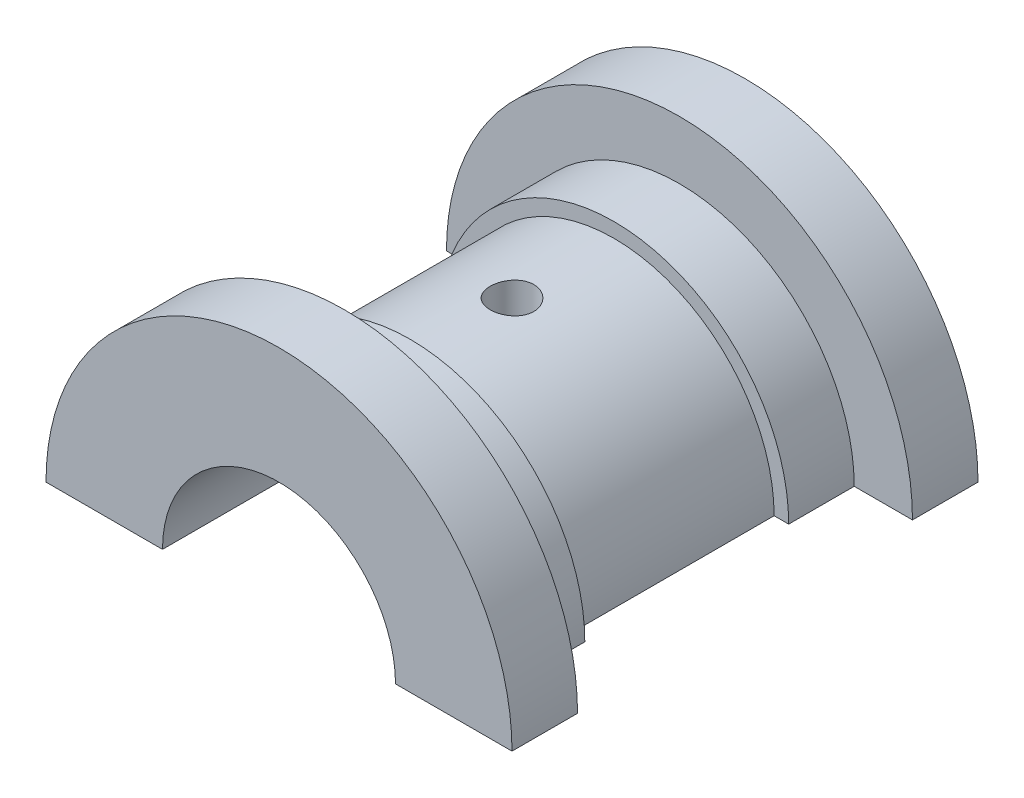
ISO-10303-21;
HEADER;
FILE_DESCRIPTION(('STEP AP214'),'2;1');
FILE_NAME('part.step','',(''),(''),'','','');
FILE_SCHEMA(('AUTOMOTIVE_DESIGN { 1 0 10303 214 1 1 1 1 }'));
ENDSEC;
DATA;
#1=APPLICATION_CONTEXT('core data for automotive mechanical design processes');
#2=APPLICATION_PROTOCOL_DEFINITION('international standard','automotive_design',2000,#1);
#3=PRODUCT_CONTEXT('',#1,'mechanical');
#4=PRODUCT('Part','Part','',(#3));
#5=PRODUCT_RELATED_PRODUCT_CATEGORY('part','',(#4));
#6=PRODUCT_DEFINITION_FORMATION('','',#4);
#7=PRODUCT_DEFINITION_CONTEXT('part definition',#1,'design');
#8=PRODUCT_DEFINITION('design','',#6,#7);
#9=PRODUCT_DEFINITION_SHAPE('','',#8);
#10=(LENGTH_UNIT() NAMED_UNIT(*) SI_UNIT(.MILLI.,.METRE.));
#11=(NAMED_UNIT(*) PLANE_ANGLE_UNIT() SI_UNIT($,.RADIAN.));
#12=(NAMED_UNIT(*) SI_UNIT($,.STERADIAN.) SOLID_ANGLE_UNIT());
#13=UNCERTAINTY_MEASURE_WITH_UNIT(LENGTH_MEASURE(1.E-05),#10,'distance_accuracy_value','');
#14=(GEOMETRIC_REPRESENTATION_CONTEXT(3) GLOBAL_UNCERTAINTY_ASSIGNED_CONTEXT((#13)) GLOBAL_UNIT_ASSIGNED_CONTEXT((#10,
#11,#12)) REPRESENTATION_CONTEXT('',''));
#15=CARTESIAN_POINT('',(0.,0.,0.));
#16=DIRECTION('',(0.,0.,1.));
#17=DIRECTION('',(1.,0.,0.));
#18=AXIS2_PLACEMENT_3D('',#15,#16,#17);
#19=CARTESIAN_POINT('',(-35.372068518765,0.,25.));
#20=DIRECTION('',(0.,1.,0.));
#21=DIRECTION('',(0.,0.,1.));
#22=AXIS2_PLACEMENT_3D('',#19,#20,#21);
#23=PLANE('',#22);
#24=DIRECTION('',(0.,0.,-1.));
#25=VECTOR('',#24,1.);
#26=CARTESIAN_POINT('',(-32.,0.,25.));
#27=LINE('',#26,#25);
#28=CARTESIAN_POINT('',(-32.,0.,16.));
#29=VERTEX_POINT('',#28);
#30=CARTESIAN_POINT('',(-32.,0.,25.));
#31=VERTEX_POINT('',#30);
#32=EDGE_CURVE('E130',#29,#31,#27,.F.);
#33=ORIENTED_EDGE('',*,*,#32,.F.);
#34=DIRECTION('',(-1.,0.,0.));
#35=VECTOR('',#34,1.);
#36=CARTESIAN_POINT('',(0.,0.,16.));
#37=LINE('',#36,#35);
#38=CARTESIAN_POINT('',(-24.,0.,16.));
#39=VERTEX_POINT('',#38);
#40=EDGE_CURVE('E149',#39,#29,#37,.T.);
#41=ORIENTED_EDGE('',*,*,#40,.F.);
#42=DIRECTION('',(0.,0.,-1.));
#43=VECTOR('',#42,1.);
#44=CARTESIAN_POINT('',(-24.,0.,16.));
#45=LINE('',#44,#43);
#46=CARTESIAN_POINT('',(-24.,0.,7.));
#47=VERTEX_POINT('',#46);
#48=EDGE_CURVE('E231',#47,#39,#45,.F.);
#49=ORIENTED_EDGE('',*,*,#48,.F.);
#50=DIRECTION('',(-1.,0.,0.));
#51=VECTOR('',#50,1.);
#52=CARTESIAN_POINT('',(0.,0.,7.));
#53=LINE('',#52,#51);
#54=CARTESIAN_POINT('',(-22.,0.,7.));
#55=VERTEX_POINT('',#54);
#56=EDGE_CURVE('E217',#55,#47,#53,.T.);
#57=ORIENTED_EDGE('',*,*,#56,.F.);
#58=DIRECTION('',(0.,0.,-1.));
#59=VECTOR('',#58,1.);
#60=CARTESIAN_POINT('',(-22.,0.,7.));
#61=LINE('',#60,#59);
#62=CARTESIAN_POINT('',(-22.,0.,-21.));
#63=VERTEX_POINT('',#62);
#64=EDGE_CURVE('E229',#63,#55,#61,.F.);
#65=ORIENTED_EDGE('',*,*,#64,.F.);
#66=DIRECTION('',(1.,0.,0.));
#67=VECTOR('',#66,1.);
#68=CARTESIAN_POINT('',(0.,0.,-21.));
#69=LINE('',#68,#67);
#70=CARTESIAN_POINT('',(-24.,0.,-21.));
#71=VERTEX_POINT('',#70);
#72=EDGE_CURVE('E211',#71,#63,#69,.T.);
#73=ORIENTED_EDGE('',*,*,#72,.F.);
#74=DIRECTION('',(0.,0.,1.));
#75=VECTOR('',#74,1.);
#76=CARTESIAN_POINT('',(-24.,0.,-30.));
#77=LINE('',#76,#75);
#78=CARTESIAN_POINT('',(-24.,0.,-30.));
#79=VERTEX_POINT('',#78);
#80=EDGE_CURVE('E65',#79,#71,#77,.T.);
#81=ORIENTED_EDGE('',*,*,#80,.F.);
#82=DIRECTION('',(1.,0.,0.));
#83=VECTOR('',#82,1.);
#84=CARTESIAN_POINT('',(0.,0.,-30.));
#85=LINE('',#84,#83);
#86=CARTESIAN_POINT('',(-32.,0.,-30.));
#87=VERTEX_POINT('',#86);
#88=EDGE_CURVE('E11',#87,#79,#85,.T.);
#89=ORIENTED_EDGE('',*,*,#88,.F.);
#90=DIRECTION('',(0.,0.,1.));
#91=VECTOR('',#90,1.);
#92=CARTESIAN_POINT('',(-32.,0.,-39.));
#93=LINE('',#92,#91);
#94=CARTESIAN_POINT('',(-32.,0.,-39.));
#95=VERTEX_POINT('',#94);
#96=EDGE_CURVE('E181',#95,#87,#93,.T.);
#97=ORIENTED_EDGE('',*,*,#96,.F.);
#98=DIRECTION('',(1.,0.,0.));
#99=VECTOR('',#98,1.);
#100=CARTESIAN_POINT('',(0.,0.,-39.));
#101=LINE('',#100,#99);
#102=CARTESIAN_POINT('',(-16.,0.,-39.));
#103=VERTEX_POINT('',#102);
#104=EDGE_CURVE('E227',#95,#103,#101,.T.);
#105=ORIENTED_EDGE('',*,*,#104,.T.);
#106=DIRECTION('',(0.,0.,-1.));
#107=VECTOR('',#106,1.);
#108=CARTESIAN_POINT('',(-16.,0.,7.));
#109=LINE('',#108,#107);
#110=CARTESIAN_POINT('',(-16.,0.,25.));
#111=VERTEX_POINT('',#110);
#112=EDGE_CURVE('E133',#103,#111,#109,.F.);
#113=ORIENTED_EDGE('',*,*,#112,.T.);
#114=DIRECTION('',(1.,0.,0.));
#115=VECTOR('',#114,1.);
#116=CARTESIAN_POINT('',(-35.372068518765,0.,25.));
#117=LINE('',#116,#115);
#118=EDGE_CURVE('E128',#31,#111,#117,.T.);
#119=ORIENTED_EDGE('',*,*,#118,.F.);
#120=EDGE_LOOP('',(#33,#41,#49,#57,#65,#73,#81,#89,#97,#105,#113,#119));
#121=FACE_BOUND('',#120,.T.);
#122=ADVANCED_FACE('F36',(#121),#23,.F.);
#123=CARTESIAN_POINT('',(0.,0.,25.));
#124=DIRECTION('',(0.,0.,1.));
#125=DIRECTION('',(1.,0.,0.));
#126=AXIS2_PLACEMENT_3D('',#123,#124,#125);
#127=PLANE('',#126);
#128=CARTESIAN_POINT('',(0.,0.,25.));
#129=DIRECTION('',(0.,0.,1.));
#130=DIRECTION('',(1.,0.,0.));
#131=AXIS2_PLACEMENT_3D('',#128,#129,#130);
#132=CIRCLE('',#131,32.);
#133=CARTESIAN_POINT('',(32.,0.,25.));
#134=VERTEX_POINT('',#133);
#135=EDGE_CURVE('E145',#134,#31,#132,.T.);
#136=ORIENTED_EDGE('',*,*,#135,.T.);
#137=ORIENTED_EDGE('',*,*,#118,.T.);
#138=CARTESIAN_POINT('',(0.,0.,25.));
#139=DIRECTION('',(0.,0.,-1.));
#140=DIRECTION('',(-1.,0.,0.));
#141=AXIS2_PLACEMENT_3D('',#138,#139,#140);
#142=CIRCLE('',#141,16.);
#143=CARTESIAN_POINT('',(16.,0.,25.));
#144=VERTEX_POINT('',#143);
#145=EDGE_CURVE('E158',#111,#144,#142,.T.);
#146=ORIENTED_EDGE('',*,*,#145,.T.);
#147=EDGE_CURVE('E138',#144,#134,#117,.T.);
#148=ORIENTED_EDGE('',*,*,#147,.T.);
#149=EDGE_LOOP('',(#136,#137,#146,#148));
#150=FACE_BOUND('',#149,.T.);
#151=ADVANCED_FACE('F152',(#150),#127,.T.);
#152=CARTESIAN_POINT('',(0.,0.,7.));
#153=DIRECTION('',(0.,0.,-1.));
#154=DIRECTION('',(-1.,0.,0.));
#155=AXIS2_PLACEMENT_3D('',#152,#153,#154);
#156=CYLINDRICAL_SURFACE('',#155,22.);
#157=CARTESIAN_POINT('',(0.,22.,-4.));
#158=CARTESIAN_POINT('',(-0.167676826859721,21.9999974934523,-4.00000703891476));
#159=CARTESIAN_POINT('',(-0.335455204579492,21.9980628542975,-4.01410518534512));
#160=CARTESIAN_POINT('',(-0.666334195282824,21.990531328169,-4.07011776644857));
#161=CARTESIAN_POINT('',(-0.829429891319713,21.984930728802,-4.11206039889967));
#162=CARTESIAN_POINT('',(-1.14610618738719,21.9706975479658,-4.22249546768124));
#163=CARTESIAN_POINT('',(-1.29969344490645,21.9620671167838,-4.29096907840417));
#164=CARTESIAN_POINT('',(-1.59317060489946,21.9427314544459,-4.45247904912042));
#165=CARTESIAN_POINT('',(-1.73306265771744,21.9320265498011,-4.54551154450858));
#166=CARTESIAN_POINT('',(-1.99611512762449,21.9096571993851,-4.75414442858463));
#167=CARTESIAN_POINT('',(-2.11917356924753,21.8979875381044,-4.86987284600693));
#168=CARTESIAN_POINT('',(-2.34418667816088,21.8750454311864,-5.12033722158478));
#169=CARTESIAN_POINT('',(-2.44614021225599,21.863773006905,-5.25507419972264));
#170=CARTESIAN_POINT('',(-2.62643701049846,21.8428507554376,-5.54040387644822));
#171=CARTESIAN_POINT('',(-2.70468332936807,21.833207660216,-5.69105837001043));
#172=CARTESIAN_POINT('',(-2.83472528970555,21.8167058813552,-6.00352363074735));
#173=CARTESIAN_POINT('',(-2.8865221221597,21.8098470723459,-6.16533389521961));
#174=CARTESIAN_POINT('',(-2.9618818111018,21.7997409938434,-6.49445248714719));
#175=CARTESIAN_POINT('',(-2.98561797729098,21.7964715644898,-6.66172043858212));
#176=CARTESIAN_POINT('',(-3.00471910119333,21.7938468760964,-6.99789494604816));
#177=CARTESIAN_POINT('',(-3.00008540995952,21.7944914306616,-7.16680142366552));
#178=CARTESIAN_POINT('',(-2.9627203403848,21.7996016067311,-7.50024345120181));
#179=CARTESIAN_POINT('',(-2.9301807783518,21.8040411420393,-7.66480095273435));
#180=CARTESIAN_POINT('',(-2.83822735390599,21.8162003481636,-7.9860980810653));
#181=CARTESIAN_POINT('',(-2.77881285300506,21.8239200969101,-8.14283752202594));
#182=CARTESIAN_POINT('',(-2.63459283520415,21.841799165874,-8.44463985207525));
#183=CARTESIAN_POINT('',(-2.54970487715522,21.851966385515,-8.58966285853603));
#184=CARTESIAN_POINT('',(-2.3570064608964,21.8735888866938,-8.86347829777156));
#185=CARTESIAN_POINT('',(-2.24919475646083,21.8850442382436,-8.99226984753348));
#186=CARTESIAN_POINT('',(-2.01265055567599,21.908067947796,-9.23107910898916));
#187=CARTESIAN_POINT('',(-1.88375290146845,21.9196364588217,-9.34093328062486));
#188=CARTESIAN_POINT('',(-1.60926188881082,21.9414949411558,-9.53747298319676));
#189=CARTESIAN_POINT('',(-1.46366847832928,21.9517849084796,-9.62415844192609));
#190=CARTESIAN_POINT('',(-1.1597859389609,21.9699350817542,-9.77190372636007));
#191=CARTESIAN_POINT('',(-1.00149126426257,21.9777942189694,-9.83295228478543));
#192=CARTESIAN_POINT('',(-0.676766175879786,21.9901879040614,-9.92755567589119));
#193=CARTESIAN_POINT('',(-0.510336216560258,21.994722637384,-9.96111204218698));
#194=CARTESIAN_POINT('',(-0.175477814735344,21.9999322760751,-9.99956416913117));
#195=CARTESIAN_POINT('',(-0.00707567277568634,22.0006374938028,-10.0046850171772));
#196=CARTESIAN_POINT('',(0.328184588178508,21.9981907754197,-9.98671624333853));
#197=CARTESIAN_POINT('',(0.495042746360838,21.9950389374767,-9.96362733943418));
#198=CARTESIAN_POINT('',(0.821806756729893,21.9852510531583,-9.89008155358068));
#199=CARTESIAN_POINT('',(0.981737441241117,21.9786288024664,-9.83973300885735));
#200=CARTESIAN_POINT('',(1.29088628219117,21.9626408812727,-9.71321048193417));
#201=CARTESIAN_POINT('',(1.44010401285043,21.9532751018062,-9.63703547396566));
#202=CARTESIAN_POINT('',(1.72458978596492,21.9327672607206,-9.46048492255194));
#203=CARTESIAN_POINT('',(1.85976745670649,21.921614741142,-9.35996499439926));
#204=CARTESIAN_POINT('',(2.11141402650921,21.8988110628535,-9.1377808440853));
#205=CARTESIAN_POINT('',(2.22788203490664,21.8871598804385,-9.01611561588667));
#206=CARTESIAN_POINT('',(2.43961065908225,21.8645773754606,-8.75409833398319));
#207=CARTESIAN_POINT('',(2.53472132761283,21.8536515002427,-8.61362457303786));
#208=CARTESIAN_POINT('',(2.69999679098531,21.8338493008832,-8.31856338460047));
#209=CARTESIAN_POINT('',(2.77016216392283,21.8249729292469,-8.16397628428285));
#210=CARTESIAN_POINT('',(2.88331699010305,21.8103129452134,-7.84554448665362));
#211=CARTESIAN_POINT('',(2.92638854100026,21.8045199979441,-7.68172941112774));
#212=CARTESIAN_POINT('',(2.98439621095037,21.7966568632046,-7.34910695634393));
#213=CARTESIAN_POINT('',(2.99933390995801,21.7945864666819,-7.1802998579713));
#214=CARTESIAN_POINT('',(3.00061713169436,21.7944097083055,-6.84397804921808));
#215=CARTESIAN_POINT('',(2.98719829381274,21.796270677241,-6.6764642067832));
#216=CARTESIAN_POINT('',(2.93265092877067,21.8036764010729,-6.34609772260303));
#217=CARTESIAN_POINT('',(2.89152241742378,21.809221153867,-6.18324507819769));
#218=CARTESIAN_POINT('',(2.7828011290096,21.8233590163958,-5.86686972122972));
#219=CARTESIAN_POINT('',(2.71522193961382,21.8319505607859,-5.71334226503493));
#220=CARTESIAN_POINT('',(2.55554079678239,21.85121622249,-5.41976740278728));
#221=CARTESIAN_POINT('',(2.46343830731648,21.8618903853246,-5.2797202914789));
#222=CARTESIAN_POINT('',(2.25645830446166,21.884224598437,-5.01587992680043));
#223=CARTESIAN_POINT('',(2.14140556846805,21.8958918112072,-4.89222472755498));
#224=CARTESIAN_POINT('',(1.89215973610724,21.9188357460712,-4.66588930657844));
#225=CARTESIAN_POINT('',(1.7579621639157,21.9301123760831,-4.56321400337727));
#226=CARTESIAN_POINT('',(1.473530986404,21.9510618593984,-4.38134806523328));
#227=CARTESIAN_POINT('',(1.32322763703472,21.9607272329125,-4.30226568344735));
#228=CARTESIAN_POINT('',(1.01141938786063,21.9772907411432,-4.17058103789405));
#229=CARTESIAN_POINT('',(0.849926624043751,21.9841918205545,-4.1179505806126));
#230=CARTESIAN_POINT('',(0.573037194174378,21.9928235213462,-4.05297912587211));
#231=CARTESIAN_POINT('',(0.459371577392145,21.9955012855773,-4.03314127840531));
#232=CARTESIAN_POINT('',(0.230486627293773,21.9990903781477,-4.00664935803757));
#233=CARTESIAN_POINT('',(0.1152673085954,22.0000017230944,-3.9999951611873));
#234=CARTESIAN_POINT('',(0.,22.,-4.));
#235=B_SPLINE_CURVE_WITH_KNOTS('',3,(#157,#158,#159,#160,#161,#162,#163,#164,#165,#166,#167,
#168,#169,#170,#171,#172,#173,#174,#175,#176,#177,#178,#179,#180,#181,#182,#183,#184,#185,#186,
#187,#188,#189,#190,#191,#192,#193,#194,#195,#196,#197,#198,#199,#200,#201,#202,#203,#204,#205,
#206,#207,#208,#209,#210,#211,#212,#213,#214,#215,#216,#217,#218,#219,#220,#221,#222,#223,#224,
#225,#226,#227,#228,#229,#230,#231,#232,#233,#234),.UNSPECIFIED.,.T.,.F.,(4,2,2,2,2,2,2,2,2,2,2,
2,2,2,2,2,2,2,2,2,2,2,2,2,2,2,2,2,2,2,2,2,2,2,2,2,2,2,4),(0.,0.502609376172301,1.00572851685898,
1.50849131075064,2.0111750366105,2.51678051739006,3.02241313883223,3.53008635854344,
4.03773671636778,4.54223504001235,5.04670933820383,5.54774357745448,6.04878972077749,
6.55147524370068,7.05418810159109,7.56104569493679,8.06790486792019,8.57498657022924,
9.08203998373342,9.58507392409649,10.0880950617602,10.5891315761909,11.0901879929896,
11.5942921539578,12.0984203054351,12.6059843025882,13.1135365364146,13.619543320099,
14.1255216863572,14.6273119749012,15.1291019770798,15.6306345481248,16.1321780825684,
16.6377084708874,17.1433572401882,17.6512916404935,18.1586835098852,18.5041992012525,
18.8497116441535),.UNSPECIFIED.);
#236=CARTESIAN_POINT('',(0.,22.,-4.));
#237=VERTEX_POINT('',#236);
#238=EDGE_CURVE('E288',#237,#237,#235,.T.);
#239=ORIENTED_EDGE('',*,*,#238,.T.);
#240=EDGE_LOOP('',(#239));
#241=FACE_BOUND('',#240,.T.);
#242=CARTESIAN_POINT('',(0.,0.,7.));
#243=DIRECTION('',(0.,0.,1.));
#244=DIRECTION('',(1.,0.,0.));
#245=AXIS2_PLACEMENT_3D('',#242,#243,#244);
#246=CIRCLE('',#245,22.);
#247=CARTESIAN_POINT('',(22.,0.,7.));
#248=VERTEX_POINT('',#247);
#249=EDGE_CURVE('E164',#248,#55,#246,.T.);
#250=ORIENTED_EDGE('',*,*,#249,.F.);
#251=DIRECTION('',(0.,0.,-1.));
#252=VECTOR('',#251,1.);
#253=CARTESIAN_POINT('',(22.,0.,7.));
#254=LINE('',#253,#252);
#255=CARTESIAN_POINT('',(22.,0.,-21.));
#256=VERTEX_POINT('',#255);
#257=EDGE_CURVE('E203',#248,#256,#254,.T.);
#258=ORIENTED_EDGE('',*,*,#257,.T.);
#259=CARTESIAN_POINT('',(0.,0.,-21.));
#260=DIRECTION('',(0.,0.,1.));
#261=DIRECTION('',(1.,0.,0.));
#262=AXIS2_PLACEMENT_3D('',#259,#260,#261);
#263=CIRCLE('',#262,22.);
#264=EDGE_CURVE('E190',#256,#63,#263,.T.);
#265=ORIENTED_EDGE('',*,*,#264,.T.);
#266=ORIENTED_EDGE('',*,*,#64,.T.);
#267=EDGE_LOOP('',(#250,#258,#265,#266));
#268=FACE_BOUND('',#267,.T.);
#269=ADVANCED_FACE('F38',(#241,#268),#156,.T.);
#270=CARTESIAN_POINT('',(0.,0.,7.));
#271=DIRECTION('',(0.,0.,-1.));
#272=DIRECTION('',(-1.,0.,0.));
#273=AXIS2_PLACEMENT_3D('',#270,#271,#272);
#274=CYLINDRICAL_SURFACE('',#273,16.);
#275=CARTESIAN_POINT('',(0.,16.,-4.));
#276=CARTESIAN_POINT('',(-0.166943492930942,15.999996976677,-4.00000637917655));
#277=CARTESIAN_POINT('',(-0.333969985460197,15.9973601984343,-4.01398215323876));
#278=CARTESIAN_POINT('',(-0.663316259683595,15.9870957178104,-4.06947999023669));
#279=CARTESIAN_POINT('',(-0.825631948304451,15.9794638033379,-4.11102530127947));
#280=CARTESIAN_POINT('',(-1.1407459237036,15.9600627753092,-4.22034540251868));
#281=CARTESIAN_POINT('',(-1.29355266137069,15.9482973989297,-4.28809650490509));
#282=CARTESIAN_POINT('',(-1.58561594618801,15.9219142119957,-4.44783775384563));
#283=CARTESIAN_POINT('',(-1.72487358895465,15.9072966323658,-4.53982593828964));
#284=CARTESIAN_POINT('',(-1.987567431861,15.8766267286101,-4.74659953600735));
#285=CARTESIAN_POINT('',(-2.11081791006366,15.860560697127,-4.86161888934027));
#286=CARTESIAN_POINT('',(-2.33639212270738,15.828906369173,-5.11068661817512));
#287=CARTESIAN_POINT('',(-2.43871435378483,15.8133181070905,-5.24473635953857));
#288=CARTESIAN_POINT('',(-2.62029997331586,15.7842510249001,-5.52937217672794));
#289=CARTESIAN_POINT('',(-2.69937443939211,15.7707898777236,-5.68008074063447));
#290=CARTESIAN_POINT('',(-2.83101048664566,15.7476942642397,-5.99293783035358));
#291=CARTESIAN_POINT('',(-2.88357435426196,15.7380594679392,-6.15508536822243));
#292=CARTESIAN_POINT('',(-2.96010107007,15.723845391491,-6.48423046182882));
#293=CARTESIAN_POINT('',(-2.98438780384078,15.7192089073281,-6.65115019440693));
#294=CARTESIAN_POINT('',(-3.00467616190693,15.7153439430552,-6.9867547696165));
#295=CARTESIAN_POINT('',(-3.00068032270748,15.7161149779752,-7.1554394526046));
#296=CARTESIAN_POINT('',(-2.96477959204725,15.7229258540351,-7.48743905053209));
#297=CARTESIAN_POINT('',(-2.9332429999209,15.7288961629467,-7.65079542860031));
#298=CARTESIAN_POINT('',(-2.84373598792414,15.7453236656933,-7.96985683956522));
#299=CARTESIAN_POINT('',(-2.78576444478999,15.7557810501903,-8.1255615470186));
#300=CARTESIAN_POINT('',(-2.644672943586,15.7800771058518,-8.42597735800053));
#301=CARTESIAN_POINT('',(-2.56140427064912,15.7939356764673,-8.57061694116162));
#302=CARTESIAN_POINT('',(-2.37218737860832,15.8234594320584,-8.84400945708047));
#303=CARTESIAN_POINT('',(-2.26623685778532,15.8391248003104,-8.9727607754296));
#304=CARTESIAN_POINT('',(-2.03267811370595,15.8708000254433,-9.21284991134492));
#305=CARTESIAN_POINT('',(-1.90475487372137,15.8868114204806,-9.32388130490349));
#306=CARTESIAN_POINT('',(-1.63193607419765,15.9171477221664,-9.52295448135081));
#307=CARTESIAN_POINT('',(-1.48704034451154,15.9314726119049,-9.61099603374084));
#308=CARTESIAN_POINT('',(-1.18406997774934,15.9568507935502,-9.76163550774003));
#309=CARTESIAN_POINT('',(-1.02597912889299,15.9678999827258,-9.82420155823579));
#310=CARTESIAN_POINT('',(-0.701278230797393,15.9854501080544,-9.92180418618432));
#311=CARTESIAN_POINT('',(-0.534669088555573,15.9919515273599,-9.95684368809071));
#312=CARTESIAN_POINT('',(-0.200297305806769,15.9996072128396,-9.99797206203654));
#313=CARTESIAN_POINT('',(-0.0325880252682693,16.0008390182456,-10.0044807830595));
#314=CARTESIAN_POINT('',(0.301522496184369,15.9980308719646,-9.9894890409047));
#315=CARTESIAN_POINT('',(0.467923800960771,15.9939911792886,-9.96798995386948));
#316=CARTESIAN_POINT('',(0.793363146436435,15.9811422300081,-9.89794192963327));
#317=CARTESIAN_POINT('',(0.952448522092127,15.9723704474806,-9.84960543492437));
#318=CARTESIAN_POINT('',(1.26025726364927,15.95103684425,-9.72748458644243));
#319=CARTESIAN_POINT('',(1.40897992519021,15.9384747662267,-9.65369850486843));
#320=CARTESIAN_POINT('',(1.69363334302643,15.9107606071533,-9.48184374368098));
#321=CARTESIAN_POINT('',(1.82940655403024,15.8955817234913,-9.38351852292632));
#322=CARTESIAN_POINT('',(2.08267664652909,15.8643868697942,-9.16572372527528));
#323=CARTESIAN_POINT('',(2.20017181952173,15.8483708216937,-9.04625217399734));
#324=CARTESIAN_POINT('',(2.41514591744096,15.817049513949,-8.78765536217715));
#325=CARTESIAN_POINT('',(2.51233832437153,15.8017565172051,-8.64829018374923));
#326=CARTESIAN_POINT('',(2.68193350115574,15.7738597115706,-8.3549647509525));
#327=CARTESIAN_POINT('',(2.75433719227848,15.761255802747,-8.20100503925905));
#328=CARTESIAN_POINT('',(2.87189347025646,15.7402604841915,-7.88358826551493));
#329=CARTESIAN_POINT('',(2.91717737589572,15.7318488087376,-7.72018124088134));
#330=CARTESIAN_POINT('',(2.97961358652471,15.7201440760483,-7.3879055549572));
#331=CARTESIAN_POINT('',(2.99676906541416,15.7168504413158,-7.2190375120592));
#332=CARTESIAN_POINT('',(3.00235524296709,15.7157839960771,-6.88350333711698));
#333=CARTESIAN_POINT('',(2.99123790006998,15.7179243194859,-6.71684483808601));
#334=CARTESIAN_POINT('',(2.94158350757606,15.7272920132,-6.38781715590943));
#335=CARTESIAN_POINT('',(2.90304662178664,15.7345193531149,-6.22544794714512));
#336=CARTESIAN_POINT('',(2.79983775166526,15.7532101604636,-5.90985103040904));
#337=CARTESIAN_POINT('',(2.73521470794505,15.7646656918993,-5.75660681730846));
#338=CARTESIAN_POINT('',(2.58171737824408,15.7905277510368,-5.46306349151831));
#339=CARTESIAN_POINT('',(2.49284137896371,15.8049344872024,-5.32276529431044));
#340=CARTESIAN_POINT('',(2.2917897467907,15.8353453221549,-5.05683263991541));
#341=CARTESIAN_POINT('',(2.17928519728607,15.8513701070609,-4.93144917486579));
#342=CARTESIAN_POINT('',(1.93485585348458,15.8830566783747,-4.70118967507095));
#343=CARTESIAN_POINT('',(1.80292660378323,15.8987183805466,-4.59631835803973));
#344=CARTESIAN_POINT('',(1.52196989014375,15.928079519361,-4.40917809474588));
#345=CARTESIAN_POINT('',(1.37279918128103,15.9417600198112,-4.32712114301872));
#346=CARTESIAN_POINT('',(1.06258022730767,15.9654323876137,-4.18936472678973));
#347=CARTESIAN_POINT('',(0.901543303410496,15.9754277175807,-4.13364050590618));
#348=CARTESIAN_POINT('',(0.616694405650309,15.9885658141526,-4.06144537116265));
#349=CARTESIAN_POINT('',(0.494547620503743,15.9928294175641,-4.0384427393744));
#350=CARTESIAN_POINT('',(0.248282494230318,15.9985475990802,-4.00771787576711));
#351=CARTESIAN_POINT('',(0.12416420330542,16.0000022485961,-3.99999525548819));
#352=CARTESIAN_POINT('',(0.,16.,-4.));
#353=B_SPLINE_CURVE_WITH_KNOTS('',3,(#275,#276,#277,#278,#279,#280,#281,#282,#283,#284,#285,
#286,#287,#288,#289,#290,#291,#292,#293,#294,#295,#296,#297,#298,#299,#300,#301,#302,#303,#304,
#305,#306,#307,#308,#309,#310,#311,#312,#313,#314,#315,#316,#317,#318,#319,#320,#321,#322,#323,
#324,#325,#326,#327,#328,#329,#330,#331,#332,#333,#334,#335,#336,#337,#338,#339,#340,#341,#342,
#343,#344,#345,#346,#347,#348,#349,#350,#351,#352),.UNSPECIFIED.,.T.,.F.,(4,2,2,2,2,2,2,2,2,2,2,
2,2,2,2,2,2,2,2,2,2,2,2,2,2,2,2,2,2,2,2,2,2,2,2,2,2,2,4),(0.,0.500376401929848,1.0011752850709,
1.50152254246181,2.00182930673781,2.50750236027261,3.01321172567233,3.52292381008715,
4.03259192623897,4.53636302890672,5.04008895174512,5.53718001225531,6.03429219693573,
6.53438525259062,7.03452908099719,7.54255536928154,8.05058675089895,8.55925176643398,
9.06786273347491,9.56896348152194,10.0700396092917,10.5672046781566,11.0644035067606,
11.5670355603542,12.069714568262,12.579068739746,13.0884039790989,13.5952525563712,
14.1020439389303,14.600785044635,15.0995231708301,15.5973299241539,16.0951718531085,
16.6004673993276,17.1058790252451,17.6158409783263,18.1253225386235,18.4974868904882,
18.8696417807908),.UNSPECIFIED.);
#354=CARTESIAN_POINT('',(0.,16.,-4.));
#355=VERTEX_POINT('',#354);
#356=EDGE_CURVE('E41',#355,#355,#353,.T.);
#357=ORIENTED_EDGE('',*,*,#356,.F.);
#358=EDGE_LOOP('',(#357));
#359=FACE_BOUND('',#358,.T.);
#360=DIRECTION('',(0.,0.,-1.));
#361=VECTOR('',#360,1.);
#362=CARTESIAN_POINT('',(16.,0.,7.));
#363=LINE('',#362,#361);
#364=CARTESIAN_POINT('',(16.,0.,-39.));
#365=VERTEX_POINT('',#364);
#366=EDGE_CURVE('E201',#144,#365,#363,.T.);
#367=ORIENTED_EDGE('',*,*,#366,.F.);
#368=ORIENTED_EDGE('',*,*,#145,.F.);
#369=ORIENTED_EDGE('',*,*,#112,.F.);
#370=CARTESIAN_POINT('',(0.,0.,-39.));
#371=DIRECTION('',(0.,0.,-1.));
#372=DIRECTION('',(-1.,0.,0.));
#373=AXIS2_PLACEMENT_3D('',#370,#371,#372);
#374=CIRCLE('',#373,16.);
#375=EDGE_CURVE('E148',#103,#365,#374,.T.);
#376=ORIENTED_EDGE('',*,*,#375,.T.);
#377=EDGE_LOOP('',(#367,#368,#369,#376));
#378=FACE_BOUND('',#377,.T.);
#379=ADVANCED_FACE('F199',(#359,#378),#274,.F.);
#380=CARTESIAN_POINT('',(0.,0.,16.));
#381=DIRECTION('',(0.,0.,-1.));
#382=DIRECTION('',(-1.,0.,0.));
#383=AXIS2_PLACEMENT_3D('',#380,#381,#382);
#384=CYLINDRICAL_SURFACE('',#383,24.);
#385=CARTESIAN_POINT('',(0.,0.,16.));
#386=DIRECTION('',(0.,0.,1.));
#387=DIRECTION('',(1.,0.,0.));
#388=AXIS2_PLACEMENT_3D('',#385,#386,#387);
#389=CIRCLE('',#388,24.);
#390=CARTESIAN_POINT('',(24.,0.,16.));
#391=VERTEX_POINT('',#390);
#392=EDGE_CURVE('E156',#391,#39,#389,.T.);
#393=ORIENTED_EDGE('',*,*,#392,.F.);
#394=DIRECTION('',(0.,0.,-1.));
#395=VECTOR('',#394,1.);
#396=CARTESIAN_POINT('',(24.,0.,16.));
#397=LINE('',#396,#395);
#398=CARTESIAN_POINT('',(24.,0.,7.));
#399=VERTEX_POINT('',#398);
#400=EDGE_CURVE('E216',#391,#399,#397,.T.);
#401=ORIENTED_EDGE('',*,*,#400,.T.);
#402=CARTESIAN_POINT('',(0.,0.,7.));
#403=DIRECTION('',(0.,0.,1.));
#404=DIRECTION('',(1.,0.,0.));
#405=AXIS2_PLACEMENT_3D('',#402,#403,#404);
#406=CIRCLE('',#405,24.);
#407=EDGE_CURVE('E153',#399,#47,#406,.T.);
#408=ORIENTED_EDGE('',*,*,#407,.T.);
#409=ORIENTED_EDGE('',*,*,#48,.T.);
#410=EDGE_LOOP('',(#393,#401,#408,#409));
#411=FACE_BOUND('',#410,.T.);
#412=ADVANCED_FACE('F240',(#411),#384,.T.);
#413=CARTESIAN_POINT('',(0.,0.,7.));
#414=DIRECTION('',(0.,0.,1.));
#415=DIRECTION('',(1.,0.,0.));
#416=AXIS2_PLACEMENT_3D('',#413,#414,#415);
#417=PLANE('',#416);
#418=ORIENTED_EDGE('',*,*,#407,.F.);
#419=EDGE_CURVE('E206',#399,#248,#53,.T.);
#420=ORIENTED_EDGE('',*,*,#419,.T.);
#421=ORIENTED_EDGE('',*,*,#249,.T.);
#422=ORIENTED_EDGE('',*,*,#56,.T.);
#423=EDGE_LOOP('',(#418,#420,#421,#422));
#424=FACE_BOUND('',#423,.T.);
#425=ADVANCED_FACE('F238',(#424),#417,.F.);
#426=CARTESIAN_POINT('',(0.,0.,25.));
#427=DIRECTION('',(0.,0.,-1.));
#428=DIRECTION('',(-1.,0.,0.));
#429=AXIS2_PLACEMENT_3D('',#426,#427,#428);
#430=CYLINDRICAL_SURFACE('',#429,32.);
#431=ORIENTED_EDGE('',*,*,#135,.F.);
#432=DIRECTION('',(0.,0.,-1.));
#433=VECTOR('',#432,1.);
#434=CARTESIAN_POINT('',(32.,0.,25.));
#435=LINE('',#434,#433);
#436=CARTESIAN_POINT('',(32.,0.,16.));
#437=VERTEX_POINT('',#436);
#438=EDGE_CURVE('E223',#134,#437,#435,.T.);
#439=ORIENTED_EDGE('',*,*,#438,.T.);
#440=CARTESIAN_POINT('',(0.,0.,16.));
#441=DIRECTION('',(0.,0.,1.));
#442=DIRECTION('',(1.,0.,0.));
#443=AXIS2_PLACEMENT_3D('',#440,#441,#442);
#444=CIRCLE('',#443,32.);
#445=EDGE_CURVE('E147',#437,#29,#444,.T.);
#446=ORIENTED_EDGE('',*,*,#445,.T.);
#447=ORIENTED_EDGE('',*,*,#32,.T.);
#448=EDGE_LOOP('',(#431,#439,#446,#447));
#449=FACE_BOUND('',#448,.T.);
#450=ADVANCED_FACE('F143',(#449),#430,.T.);
#451=CARTESIAN_POINT('',(0.,0.,16.));
#452=DIRECTION('',(0.,0.,1.));
#453=DIRECTION('',(1.,0.,0.));
#454=AXIS2_PLACEMENT_3D('',#451,#452,#453);
#455=PLANE('',#454);
#456=ORIENTED_EDGE('',*,*,#445,.F.);
#457=EDGE_CURVE('E220',#437,#391,#37,.T.);
#458=ORIENTED_EDGE('',*,*,#457,.T.);
#459=ORIENTED_EDGE('',*,*,#392,.T.);
#460=ORIENTED_EDGE('',*,*,#40,.T.);
#461=EDGE_LOOP('',(#456,#458,#459,#460));
#462=FACE_BOUND('',#461,.T.);
#463=ADVANCED_FACE('F243',(#462),#455,.F.);
#464=CARTESIAN_POINT('',(0.,0.,-30.));
#465=DIRECTION('',(0.,0.,1.));
#466=DIRECTION('',(-1.,0.,0.));
#467=AXIS2_PLACEMENT_3D('',#464,#465,#466);
#468=CYLINDRICAL_SURFACE('',#467,24.);
#469=CARTESIAN_POINT('',(0.,0.,-30.));
#470=DIRECTION('',(0.,0.,1.));
#471=DIRECTION('',(1.,0.,0.));
#472=AXIS2_PLACEMENT_3D('',#469,#470,#471);
#473=CIRCLE('',#472,24.);
#474=CARTESIAN_POINT('',(24.,0.,-30.));
#475=VERTEX_POINT('',#474);
#476=EDGE_CURVE('E174',#475,#79,#473,.T.);
#477=ORIENTED_EDGE('',*,*,#476,.T.);
#478=ORIENTED_EDGE('',*,*,#80,.T.);
#479=CARTESIAN_POINT('',(0.,0.,-21.));
#480=DIRECTION('',(0.,0.,1.));
#481=DIRECTION('',(1.,0.,0.));
#482=AXIS2_PLACEMENT_3D('',#479,#480,#481);
#483=CIRCLE('',#482,24.);
#484=CARTESIAN_POINT('',(24.,0.,-21.));
#485=VERTEX_POINT('',#484);
#486=EDGE_CURVE('E184',#485,#71,#483,.T.);
#487=ORIENTED_EDGE('',*,*,#486,.F.);
#488=DIRECTION('',(0.,0.,1.));
#489=VECTOR('',#488,1.);
#490=CARTESIAN_POINT('',(24.,0.,-30.));
#491=LINE('',#490,#489);
#492=EDGE_CURVE('E284',#485,#475,#491,.F.);
#493=ORIENTED_EDGE('',*,*,#492,.T.);
#494=EDGE_LOOP('',(#477,#478,#487,#493));
#495=FACE_BOUND('',#494,.T.);
#496=ADVANCED_FACE('F245',(#495),#468,.T.);
#497=CARTESIAN_POINT('',(0.,0.,-21.));
#498=DIRECTION('',(0.,0.,-1.));
#499=DIRECTION('',(1.,0.,0.));
#500=AXIS2_PLACEMENT_3D('',#497,#498,#499);
#501=PLANE('',#500);
#502=ORIENTED_EDGE('',*,*,#486,.T.);
#503=ORIENTED_EDGE('',*,*,#72,.T.);
#504=ORIENTED_EDGE('',*,*,#264,.F.);
#505=EDGE_CURVE('E204',#256,#485,#69,.T.);
#506=ORIENTED_EDGE('',*,*,#505,.T.);
#507=EDGE_LOOP('',(#502,#503,#504,#506));
#508=FACE_BOUND('',#507,.T.);
#509=ADVANCED_FACE('F251',(#508),#501,.F.);
#510=CARTESIAN_POINT('',(0.,0.,-39.));
#511=DIRECTION('',(0.,0.,1.));
#512=DIRECTION('',(-1.,0.,0.));
#513=AXIS2_PLACEMENT_3D('',#510,#511,#512);
#514=CYLINDRICAL_SURFACE('',#513,32.);
#515=CARTESIAN_POINT('',(0.,0.,-39.));
#516=DIRECTION('',(0.,0.,1.));
#517=DIRECTION('',(1.,0.,0.));
#518=AXIS2_PLACEMENT_3D('',#515,#516,#517);
#519=CIRCLE('',#518,32.);
#520=CARTESIAN_POINT('',(32.,0.,-39.));
#521=VERTEX_POINT('',#520);
#522=EDGE_CURVE('E182',#521,#95,#519,.T.);
#523=ORIENTED_EDGE('',*,*,#522,.T.);
#524=ORIENTED_EDGE('',*,*,#96,.T.);
#525=CARTESIAN_POINT('',(0.,0.,-30.));
#526=DIRECTION('',(0.,0.,1.));
#527=DIRECTION('',(1.,0.,0.));
#528=AXIS2_PLACEMENT_3D('',#525,#526,#527);
#529=CIRCLE('',#528,32.);
#530=CARTESIAN_POINT('',(32.,0.,-30.));
#531=VERTEX_POINT('',#530);
#532=EDGE_CURVE('E172',#531,#87,#529,.T.);
#533=ORIENTED_EDGE('',*,*,#532,.F.);
#534=DIRECTION('',(0.,0.,1.));
#535=VECTOR('',#534,1.);
#536=CARTESIAN_POINT('',(32.,0.,-39.));
#537=LINE('',#536,#535);
#538=EDGE_CURVE('E57',#531,#521,#537,.F.);
#539=ORIENTED_EDGE('',*,*,#538,.T.);
#540=EDGE_LOOP('',(#523,#524,#533,#539));
#541=FACE_BOUND('',#540,.T.);
#542=ADVANCED_FACE('F179',(#541),#514,.T.);
#543=CARTESIAN_POINT('',(0.,0.,-39.));
#544=DIRECTION('',(0.,0.,-1.));
#545=DIRECTION('',(1.,0.,0.));
#546=AXIS2_PLACEMENT_3D('',#543,#544,#545);
#547=PLANE('',#546);
#548=ORIENTED_EDGE('',*,*,#104,.F.);
#549=ORIENTED_EDGE('',*,*,#522,.F.);
#550=EDGE_CURVE('E209',#365,#521,#101,.T.);
#551=ORIENTED_EDGE('',*,*,#550,.F.);
#552=ORIENTED_EDGE('',*,*,#375,.F.);
#553=EDGE_LOOP('',(#548,#549,#551,#552));
#554=FACE_BOUND('',#553,.T.);
#555=ADVANCED_FACE('F269',(#554),#547,.T.);
#556=CARTESIAN_POINT('',(0.,0.,-30.));
#557=DIRECTION('',(0.,0.,-1.));
#558=DIRECTION('',(1.,0.,0.));
#559=AXIS2_PLACEMENT_3D('',#556,#557,#558);
#560=PLANE('',#559);
#561=ORIENTED_EDGE('',*,*,#532,.T.);
#562=ORIENTED_EDGE('',*,*,#88,.T.);
#563=ORIENTED_EDGE('',*,*,#476,.F.);
#564=EDGE_CURVE('E50',#475,#531,#85,.T.);
#565=ORIENTED_EDGE('',*,*,#564,.T.);
#566=EDGE_LOOP('',(#561,#562,#563,#565));
#567=FACE_BOUND('',#566,.T.);
#568=ADVANCED_FACE('F171',(#567),#560,.F.);
#569=ORIENTED_EDGE('',*,*,#438,.F.);
#570=ORIENTED_EDGE('',*,*,#147,.F.);
#571=ORIENTED_EDGE('',*,*,#366,.T.);
#572=ORIENTED_EDGE('',*,*,#550,.T.);
#573=ORIENTED_EDGE('',*,*,#538,.F.);
#574=ORIENTED_EDGE('',*,*,#564,.F.);
#575=ORIENTED_EDGE('',*,*,#492,.F.);
#576=ORIENTED_EDGE('',*,*,#505,.F.);
#577=ORIENTED_EDGE('',*,*,#257,.F.);
#578=ORIENTED_EDGE('',*,*,#419,.F.);
#579=ORIENTED_EDGE('',*,*,#400,.F.);
#580=ORIENTED_EDGE('',*,*,#457,.F.);
#581=EDGE_LOOP('',(#569,#570,#571,#572,#573,#574,#575,#576,#577,#578,#579,#580));
#582=FACE_BOUND('',#581,.T.);
#583=ADVANCED_FACE('F241',(#582),#23,.F.);
#584=CARTESIAN_POINT('',(0.,0.,-7.));
#585=DIRECTION('',(0.,1.,0.));
#586=DIRECTION('',(0.,0.,1.));
#587=AXIS2_PLACEMENT_3D('',#584,#585,#586);
#588=CYLINDRICAL_SURFACE('',#587,3.);
#589=ORIENTED_EDGE('',*,*,#356,.T.);
#590=EDGE_LOOP('',(#589));
#591=FACE_BOUND('',#590,.T.);
#592=ORIENTED_EDGE('',*,*,#238,.F.);
#593=EDGE_LOOP('',(#592));
#594=FACE_BOUND('',#593,.T.);
#595=ADVANCED_FACE('F263',(#591,#594),#588,.F.);
#596=CLOSED_SHELL('',(#122,#151,#269,#379,#412,#425,#450,#463,#496,#509,#542,#555,#568,#583,#595));
#597=MANIFOLD_SOLID_BREP('B2',#596);
#598=ADVANCED_BREP_SHAPE_REPRESENTATION('',(#18,#597),#14);
#599=SHAPE_DEFINITION_REPRESENTATION(#9,#598);
ENDSEC;
END-ISO-10303-21;
